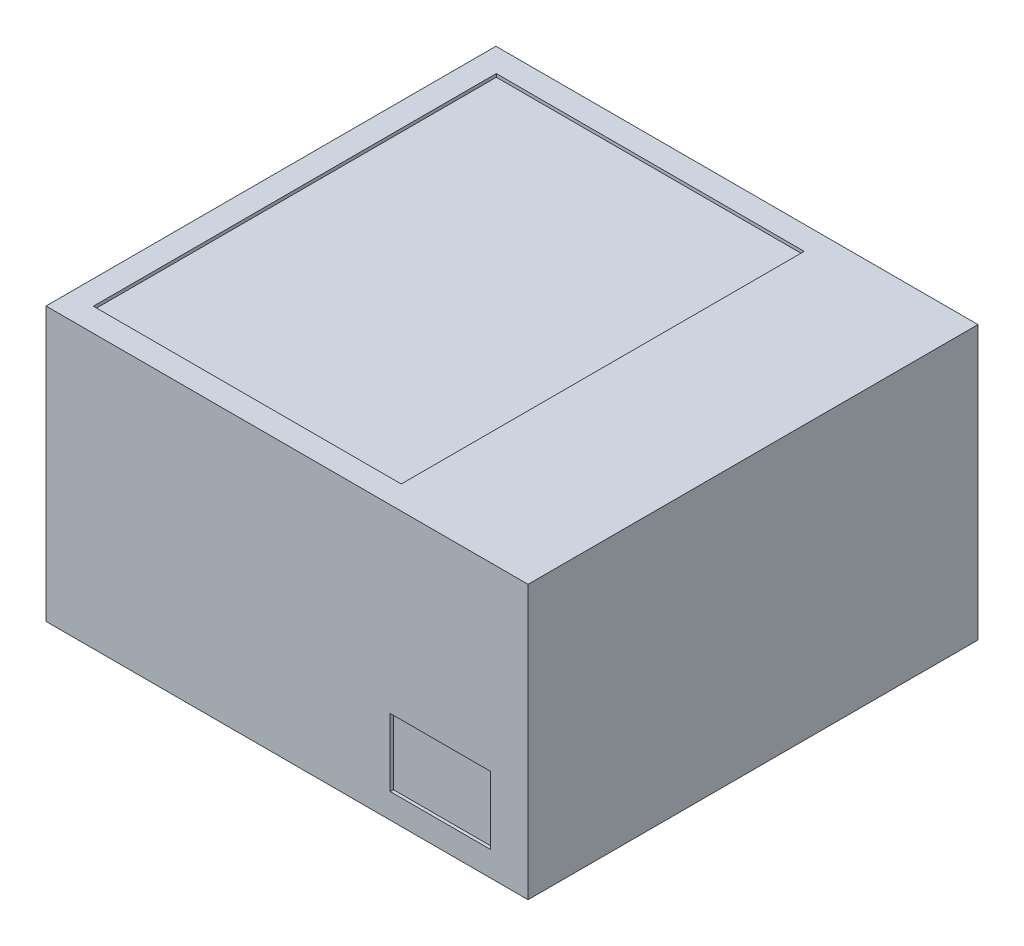
ISO-10303-21;
HEADER;
FILE_DESCRIPTION(('STEP AP214'),'2;1');
FILE_NAME('part.step','',(''),(''),'','','');
FILE_SCHEMA(('AUTOMOTIVE_DESIGN { 1 0 10303 214 1 1 1 1 }'));
ENDSEC;
DATA;
#1=APPLICATION_CONTEXT('core data for automotive mechanical design processes');
#2=APPLICATION_PROTOCOL_DEFINITION('international standard','automotive_design',2000,#1);
#3=PRODUCT_CONTEXT('',#1,'mechanical');
#4=PRODUCT('Part','Part','',(#3));
#5=PRODUCT_RELATED_PRODUCT_CATEGORY('part','',(#4));
#6=PRODUCT_DEFINITION_FORMATION('','',#4);
#7=PRODUCT_DEFINITION_CONTEXT('part definition',#1,'design');
#8=PRODUCT_DEFINITION('design','',#6,#7);
#9=PRODUCT_DEFINITION_SHAPE('','',#8);
#10=(LENGTH_UNIT() NAMED_UNIT(*) SI_UNIT(.MILLI.,.METRE.));
#11=(NAMED_UNIT(*) PLANE_ANGLE_UNIT() SI_UNIT($,.RADIAN.));
#12=(NAMED_UNIT(*) SI_UNIT($,.STERADIAN.) SOLID_ANGLE_UNIT());
#13=UNCERTAINTY_MEASURE_WITH_UNIT(LENGTH_MEASURE(1.E-05),#10,'distance_accuracy_value','');
#14=(GEOMETRIC_REPRESENTATION_CONTEXT(3) GLOBAL_UNCERTAINTY_ASSIGNED_CONTEXT((#13)) GLOBAL_UNIT_ASSIGNED_CONTEXT((#10,
#11,#12)) REPRESENTATION_CONTEXT('',''));
#15=CARTESIAN_POINT('',(0.,0.,0.));
#16=DIRECTION('',(0.,0.,1.));
#17=DIRECTION('',(1.,0.,0.));
#18=AXIS2_PLACEMENT_3D('',#15,#16,#17);
#19=CARTESIAN_POINT('',(75.,85.,-70.));
#20=DIRECTION('',(-1.,0.,0.));
#21=DIRECTION('',(0.,0.,1.));
#22=AXIS2_PLACEMENT_3D('',#19,#20,#21);
#23=PLANE('',#22);
#24=DIRECTION('',(0.,0.,-1.));
#25=VECTOR('',#24,1.);
#26=CARTESIAN_POINT('',(75.,0.,-70.));
#27=LINE('',#26,#25);
#28=CARTESIAN_POINT('',(75.,0.,70.));
#29=VERTEX_POINT('',#28);
#30=CARTESIAN_POINT('',(75.,0.,-70.));
#31=VERTEX_POINT('',#30);
#32=EDGE_CURVE('E184',#29,#31,#27,.T.);
#33=ORIENTED_EDGE('',*,*,#32,.T.);
#34=DIRECTION('',(0.,-1.,0.));
#35=VECTOR('',#34,1.);
#36=CARTESIAN_POINT('',(75.,85.,-70.));
#37=LINE('',#36,#35);
#38=CARTESIAN_POINT('',(75.,85.,-70.));
#39=VERTEX_POINT('',#38);
#40=EDGE_CURVE('E11',#39,#31,#37,.T.);
#41=ORIENTED_EDGE('',*,*,#40,.F.);
#42=DIRECTION('',(0.,0.,-1.));
#43=VECTOR('',#42,1.);
#44=CARTESIAN_POINT('',(75.,85.,-70.));
#45=LINE('',#44,#43);
#46=CARTESIAN_POINT('',(75.,85.,70.));
#47=VERTEX_POINT('',#46);
#48=EDGE_CURVE('E190',#47,#39,#45,.T.);
#49=ORIENTED_EDGE('',*,*,#48,.F.);
#50=DIRECTION('',(0.,-1.,0.));
#51=VECTOR('',#50,1.);
#52=CARTESIAN_POINT('',(75.,85.,70.));
#53=LINE('',#52,#51);
#54=EDGE_CURVE('E200',#47,#29,#53,.T.);
#55=ORIENTED_EDGE('',*,*,#54,.T.);
#56=EDGE_LOOP('',(#33,#41,#49,#55));
#57=FACE_BOUND('',#56,.T.);
#58=ADVANCED_FACE('F33',(#57),#23,.F.);
#59=CARTESIAN_POINT('',(-75.,85.,-70.));
#60=DIRECTION('',(0.,0.,1.));
#61=DIRECTION('',(1.,0.,0.));
#62=AXIS2_PLACEMENT_3D('',#59,#60,#61);
#63=PLANE('',#62);
#64=DIRECTION('',(-1.,0.,0.));
#65=VECTOR('',#64,1.);
#66=CARTESIAN_POINT('',(-75.,0.,-70.));
#67=LINE('',#66,#65);
#68=CARTESIAN_POINT('',(-75.,0.,-70.));
#69=VERTEX_POINT('',#68);
#70=EDGE_CURVE('E203',#31,#69,#67,.T.);
#71=ORIENTED_EDGE('',*,*,#70,.T.);
#72=DIRECTION('',(0.,-1.,0.));
#73=VECTOR('',#72,1.);
#74=CARTESIAN_POINT('',(-75.,85.,-70.));
#75=LINE('',#74,#73);
#76=CARTESIAN_POINT('',(-75.,85.,-70.));
#77=VERTEX_POINT('',#76);
#78=EDGE_CURVE('E40',#77,#69,#75,.T.);
#79=ORIENTED_EDGE('',*,*,#78,.F.);
#80=DIRECTION('',(-1.,0.,0.));
#81=VECTOR('',#80,1.);
#82=CARTESIAN_POINT('',(-75.,85.,-70.));
#83=LINE('',#82,#81);
#84=EDGE_CURVE('E193',#39,#77,#83,.T.);
#85=ORIENTED_EDGE('',*,*,#84,.F.);
#86=ORIENTED_EDGE('',*,*,#40,.T.);
#87=EDGE_LOOP('',(#71,#79,#85,#86));
#88=FACE_BOUND('',#87,.T.);
#89=ADVANCED_FACE('F233',(#88),#63,.F.);
#90=CARTESIAN_POINT('',(-75.,85.,-70.));
#91=DIRECTION('',(1.,0.,0.));
#92=DIRECTION('',(0.,0.,-1.));
#93=AXIS2_PLACEMENT_3D('',#90,#91,#92);
#94=PLANE('',#93);
#95=DIRECTION('',(0.,0.,1.));
#96=VECTOR('',#95,1.);
#97=CARTESIAN_POINT('',(-75.,0.,-70.));
#98=LINE('',#97,#96);
#99=CARTESIAN_POINT('',(-75.,0.,70.));
#100=VERTEX_POINT('',#99);
#101=EDGE_CURVE('E205',#69,#100,#98,.T.);
#102=ORIENTED_EDGE('',*,*,#101,.T.);
#103=DIRECTION('',(0.,-1.,0.));
#104=VECTOR('',#103,1.);
#105=CARTESIAN_POINT('',(-75.,85.,70.));
#106=LINE('',#105,#104);
#107=CARTESIAN_POINT('',(-75.,85.,70.));
#108=VERTEX_POINT('',#107);
#109=EDGE_CURVE('E210',#108,#100,#106,.T.);
#110=ORIENTED_EDGE('',*,*,#109,.F.);
#111=DIRECTION('',(0.,0.,1.));
#112=VECTOR('',#111,1.);
#113=CARTESIAN_POINT('',(-75.,85.,-70.));
#114=LINE('',#113,#112);
#115=EDGE_CURVE('E196',#77,#108,#114,.T.);
#116=ORIENTED_EDGE('',*,*,#115,.F.);
#117=ORIENTED_EDGE('',*,*,#78,.T.);
#118=EDGE_LOOP('',(#102,#110,#116,#117));
#119=FACE_BOUND('',#118,.T.);
#120=ADVANCED_FACE('F217',(#119),#94,.F.);
#121=CARTESIAN_POINT('',(-75.,85.,70.));
#122=DIRECTION('',(0.,0.,-1.));
#123=DIRECTION('',(-1.,0.,0.));
#124=AXIS2_PLACEMENT_3D('',#121,#122,#123);
#125=PLANE('',#124);
#126=DIRECTION('',(-1.,0.,0.));
#127=VECTOR('',#126,1.);
#128=CARTESIAN_POINT('',(32.1031916807303,28.7582284713324,70.));
#129=LINE('',#128,#127);
#130=CARTESIAN_POINT('',(63.3086157222107,28.7582284713324,70.));
#131=VERTEX_POINT('',#130);
#132=CARTESIAN_POINT('',(32.1031916807303,28.7582284713324,70.));
#133=VERTEX_POINT('',#132);
#134=EDGE_CURVE('E174',#131,#133,#129,.T.);
#135=ORIENTED_EDGE('',*,*,#134,.F.);
#136=DIRECTION('',(0.,1.,0.));
#137=VECTOR('',#136,1.);
#138=CARTESIAN_POINT('',(63.3086157222107,28.7582284713324,70.));
#139=LINE('',#138,#137);
#140=CARTESIAN_POINT('',(63.3086157222107,7.71254953386347,70.));
#141=VERTEX_POINT('',#140);
#142=EDGE_CURVE('E55',#141,#131,#139,.T.);
#143=ORIENTED_EDGE('',*,*,#142,.F.);
#144=DIRECTION('',(1.,0.,0.));
#145=VECTOR('',#144,1.);
#146=CARTESIAN_POINT('',(32.1031916807303,7.71254953386347,70.));
#147=LINE('',#146,#145);
#148=CARTESIAN_POINT('',(32.1031916807303,7.71254953386347,70.));
#149=VERTEX_POINT('',#148);
#150=EDGE_CURVE('E163',#149,#141,#147,.T.);
#151=ORIENTED_EDGE('',*,*,#150,.F.);
#152=DIRECTION('',(0.,-1.,0.));
#153=VECTOR('',#152,1.);
#154=CARTESIAN_POINT('',(32.1031916807303,28.7582284713324,70.));
#155=LINE('',#154,#153);
#156=EDGE_CURVE('E177',#133,#149,#155,.T.);
#157=ORIENTED_EDGE('',*,*,#156,.F.);
#158=EDGE_LOOP('',(#135,#143,#151,#157));
#159=FACE_BOUND('',#158,.T.);
#160=DIRECTION('',(1.,0.,0.));
#161=VECTOR('',#160,1.);
#162=CARTESIAN_POINT('',(-75.,0.,70.));
#163=LINE('',#162,#161);
#164=EDGE_CURVE('E194',#100,#29,#163,.T.);
#165=ORIENTED_EDGE('',*,*,#164,.T.);
#166=ORIENTED_EDGE('',*,*,#54,.F.);
#167=DIRECTION('',(1.,0.,0.));
#168=VECTOR('',#167,1.);
#169=CARTESIAN_POINT('',(-75.,85.,70.));
#170=LINE('',#169,#168);
#171=EDGE_CURVE('E198',#108,#47,#170,.T.);
#172=ORIENTED_EDGE('',*,*,#171,.F.);
#173=ORIENTED_EDGE('',*,*,#109,.T.);
#174=EDGE_LOOP('',(#165,#166,#172,#173));
#175=FACE_BOUND('',#174,.T.);
#176=ADVANCED_FACE('F226',(#159,#175),#125,.F.);
#177=CARTESIAN_POINT('',(0.,85.,0.));
#178=DIRECTION('',(0.,1.,0.));
#179=DIRECTION('',(0.,0.,1.));
#180=AXIS2_PLACEMENT_3D('',#177,#178,#179);
#181=PLANE('',#180);
#182=DIRECTION('',(0.,0.,-1.));
#183=VECTOR('',#182,1.);
#184=CARTESIAN_POINT('',(28.2332079092171,85.,-62.6933496527897));
#185=LINE('',#184,#183);
#186=CARTESIAN_POINT('',(28.2332079092171,85.,62.6933496527897));
#187=VERTEX_POINT('',#186);
#188=CARTESIAN_POINT('',(28.2332079092171,85.,-62.6933496527897));
#189=VERTEX_POINT('',#188);
#190=EDGE_CURVE('E47',#187,#189,#185,.T.);
#191=ORIENTED_EDGE('',*,*,#190,.F.);
#192=DIRECTION('',(1.,0.,0.));
#193=VECTOR('',#192,1.);
#194=CARTESIAN_POINT('',(-67.5798940687358,85.,62.6933496527897));
#195=LINE('',#194,#193);
#196=CARTESIAN_POINT('',(-67.5798940687358,85.,62.6933496527897));
#197=VERTEX_POINT('',#196);
#198=EDGE_CURVE('E141',#197,#187,#195,.T.);
#199=ORIENTED_EDGE('',*,*,#198,.F.);
#200=DIRECTION('',(0.,0.,1.));
#201=VECTOR('',#200,1.);
#202=CARTESIAN_POINT('',(-67.5798940687358,85.,-62.6933496527897));
#203=LINE('',#202,#201);
#204=CARTESIAN_POINT('',(-67.5798940687358,85.,-62.6933496527897));
#205=VERTEX_POINT('',#204);
#206=EDGE_CURVE('E144',#205,#197,#203,.T.);
#207=ORIENTED_EDGE('',*,*,#206,.F.);
#208=DIRECTION('',(-1.,0.,0.));
#209=VECTOR('',#208,1.);
#210=CARTESIAN_POINT('',(-67.5798940687358,85.,-62.6933496527897));
#211=LINE('',#210,#209);
#212=EDGE_CURVE('E150',#189,#205,#211,.T.);
#213=ORIENTED_EDGE('',*,*,#212,.F.);
#214=EDGE_LOOP('',(#191,#199,#207,#213));
#215=FACE_BOUND('',#214,.T.);
#216=ORIENTED_EDGE('',*,*,#48,.T.);
#217=ORIENTED_EDGE('',*,*,#84,.T.);
#218=ORIENTED_EDGE('',*,*,#115,.T.);
#219=ORIENTED_EDGE('',*,*,#171,.T.);
#220=EDGE_LOOP('',(#216,#217,#218,#219));
#221=FACE_BOUND('',#220,.T.);
#222=ADVANCED_FACE('F232',(#215,#221),#181,.T.);
#223=CARTESIAN_POINT('',(0.,0.,0.));
#224=DIRECTION('',(0.,1.,0.));
#225=DIRECTION('',(0.,0.,1.));
#226=AXIS2_PLACEMENT_3D('',#223,#224,#225);
#227=PLANE('',#226);
#228=ORIENTED_EDGE('',*,*,#32,.F.);
#229=ORIENTED_EDGE('',*,*,#164,.F.);
#230=ORIENTED_EDGE('',*,*,#101,.F.);
#231=ORIENTED_EDGE('',*,*,#70,.F.);
#232=EDGE_LOOP('',(#228,#229,#230,#231));
#233=FACE_BOUND('',#232,.T.);
#234=ADVANCED_FACE('F223',(#233),#227,.F.);
#235=CARTESIAN_POINT('',(63.3086157222107,28.7582284713324,69.));
#236=DIRECTION('',(1.,0.,0.));
#237=DIRECTION('',(0.,0.,-1.));
#238=AXIS2_PLACEMENT_3D('',#235,#236,#237);
#239=PLANE('',#238);
#240=ORIENTED_EDGE('',*,*,#142,.T.);
#241=DIRECTION('',(0.,0.,1.));
#242=VECTOR('',#241,1.);
#243=CARTESIAN_POINT('',(63.3086157222107,28.7582284713324,69.));
#244=LINE('',#243,#242);
#245=CARTESIAN_POINT('',(63.3086157222107,28.7582284713324,69.));
#246=VERTEX_POINT('',#245);
#247=EDGE_CURVE('E172',#246,#131,#244,.T.);
#248=ORIENTED_EDGE('',*,*,#247,.F.);
#249=DIRECTION('',(0.,1.,0.));
#250=VECTOR('',#249,1.);
#251=CARTESIAN_POINT('',(63.3086157222107,28.7582284713324,69.));
#252=LINE('',#251,#250);
#253=CARTESIAN_POINT('',(63.3086157222107,7.71254953386347,69.));
#254=VERTEX_POINT('',#253);
#255=EDGE_CURVE('E159',#254,#246,#252,.T.);
#256=ORIENTED_EDGE('',*,*,#255,.F.);
#257=DIRECTION('',(0.,0.,1.));
#258=VECTOR('',#257,1.);
#259=CARTESIAN_POINT('',(63.3086157222107,7.71254953386347,69.));
#260=LINE('',#259,#258);
#261=EDGE_CURVE('E182',#254,#141,#260,.T.);
#262=ORIENTED_EDGE('',*,*,#261,.T.);
#263=EDGE_LOOP('',(#240,#248,#256,#262));
#264=FACE_BOUND('',#263,.T.);
#265=ADVANCED_FACE('F246',(#264),#239,.F.);
#266=CARTESIAN_POINT('',(32.1031916807303,7.71254953386347,69.));
#267=DIRECTION('',(0.,-1.,0.));
#268=DIRECTION('',(0.,0.,-1.));
#269=AXIS2_PLACEMENT_3D('',#266,#267,#268);
#270=PLANE('',#269);
#271=ORIENTED_EDGE('',*,*,#150,.T.);
#272=ORIENTED_EDGE('',*,*,#261,.F.);
#273=DIRECTION('',(1.,0.,0.));
#274=VECTOR('',#273,1.);
#275=CARTESIAN_POINT('',(32.1031916807303,7.71254953386347,69.));
#276=LINE('',#275,#274);
#277=CARTESIAN_POINT('',(32.1031916807303,7.71254953386347,69.));
#278=VERTEX_POINT('',#277);
#279=EDGE_CURVE('E169',#278,#254,#276,.T.);
#280=ORIENTED_EDGE('',*,*,#279,.F.);
#281=DIRECTION('',(0.,0.,1.));
#282=VECTOR('',#281,1.);
#283=CARTESIAN_POINT('',(32.1031916807303,7.71254953386347,69.));
#284=LINE('',#283,#282);
#285=EDGE_CURVE('E185',#278,#149,#284,.T.);
#286=ORIENTED_EDGE('',*,*,#285,.T.);
#287=EDGE_LOOP('',(#271,#272,#280,#286));
#288=FACE_BOUND('',#287,.T.);
#289=ADVANCED_FACE('F252',(#288),#270,.F.);
#290=CARTESIAN_POINT('',(32.1031916807303,28.7582284713324,69.));
#291=DIRECTION('',(-1.,0.,0.));
#292=DIRECTION('',(0.,0.,1.));
#293=AXIS2_PLACEMENT_3D('',#290,#291,#292);
#294=PLANE('',#293);
#295=ORIENTED_EDGE('',*,*,#156,.T.);
#296=ORIENTED_EDGE('',*,*,#285,.F.);
#297=DIRECTION('',(0.,-1.,0.));
#298=VECTOR('',#297,1.);
#299=CARTESIAN_POINT('',(32.1031916807303,28.7582284713324,69.));
#300=LINE('',#299,#298);
#301=CARTESIAN_POINT('',(32.1031916807303,28.7582284713324,69.));
#302=VERTEX_POINT('',#301);
#303=EDGE_CURVE('E166',#302,#278,#300,.T.);
#304=ORIENTED_EDGE('',*,*,#303,.F.);
#305=DIRECTION('',(0.,0.,1.));
#306=VECTOR('',#305,1.);
#307=CARTESIAN_POINT('',(32.1031916807303,28.7582284713324,69.));
#308=LINE('',#307,#306);
#309=EDGE_CURVE('E187',#302,#133,#308,.T.);
#310=ORIENTED_EDGE('',*,*,#309,.T.);
#311=EDGE_LOOP('',(#295,#296,#304,#310));
#312=FACE_BOUND('',#311,.T.);
#313=ADVANCED_FACE('F257',(#312),#294,.F.);
#314=CARTESIAN_POINT('',(32.1031916807303,28.7582284713324,69.));
#315=DIRECTION('',(0.,1.,0.));
#316=DIRECTION('',(0.,0.,1.));
#317=AXIS2_PLACEMENT_3D('',#314,#315,#316);
#318=PLANE('',#317);
#319=ORIENTED_EDGE('',*,*,#134,.T.);
#320=ORIENTED_EDGE('',*,*,#309,.F.);
#321=DIRECTION('',(-1.,0.,0.));
#322=VECTOR('',#321,1.);
#323=CARTESIAN_POINT('',(32.1031916807303,28.7582284713324,69.));
#324=LINE('',#323,#322);
#325=EDGE_CURVE('E162',#246,#302,#324,.T.);
#326=ORIENTED_EDGE('',*,*,#325,.F.);
#327=ORIENTED_EDGE('',*,*,#247,.T.);
#328=EDGE_LOOP('',(#319,#320,#326,#327));
#329=FACE_BOUND('',#328,.T.);
#330=ADVANCED_FACE('F253',(#329),#318,.F.);
#331=CARTESIAN_POINT('',(0.,0.,69.));
#332=DIRECTION('',(0.,0.,1.));
#333=DIRECTION('',(1.,0.,0.));
#334=AXIS2_PLACEMENT_3D('',#331,#332,#333);
#335=PLANE('',#334);
#336=ORIENTED_EDGE('',*,*,#255,.T.);
#337=ORIENTED_EDGE('',*,*,#325,.T.);
#338=ORIENTED_EDGE('',*,*,#303,.T.);
#339=ORIENTED_EDGE('',*,*,#279,.T.);
#340=EDGE_LOOP('',(#336,#337,#338,#339));
#341=FACE_BOUND('',#340,.T.);
#342=ADVANCED_FACE('F256',(#341),#335,.T.);
#343=CARTESIAN_POINT('',(28.2332079092171,84.,-62.6933496527897));
#344=DIRECTION('',(1.,0.,0.));
#345=DIRECTION('',(0.,0.,-1.));
#346=AXIS2_PLACEMENT_3D('',#343,#344,#345);
#347=PLANE('',#346);
#348=ORIENTED_EDGE('',*,*,#190,.T.);
#349=DIRECTION('',(0.,1.,0.));
#350=VECTOR('',#349,1.);
#351=CARTESIAN_POINT('',(28.2332079092171,84.,-62.6933496527897));
#352=LINE('',#351,#350);
#353=CARTESIAN_POINT('',(28.2332079092171,84.,-62.6933496527897));
#354=VERTEX_POINT('',#353);
#355=EDGE_CURVE('E119',#354,#189,#352,.T.);
#356=ORIENTED_EDGE('',*,*,#355,.F.);
#357=DIRECTION('',(0.,0.,-1.));
#358=VECTOR('',#357,1.);
#359=CARTESIAN_POINT('',(28.2332079092171,84.,-62.6933496527897));
#360=LINE('',#359,#358);
#361=CARTESIAN_POINT('',(28.2332079092171,84.,62.6933496527897));
#362=VERTEX_POINT('',#361);
#363=EDGE_CURVE('E123',#362,#354,#360,.T.);
#364=ORIENTED_EDGE('',*,*,#363,.F.);
#365=DIRECTION('',(0.,1.,0.));
#366=VECTOR('',#365,1.);
#367=CARTESIAN_POINT('',(28.2332079092171,84.,62.6933496527897));
#368=LINE('',#367,#366);
#369=EDGE_CURVE('E154',#362,#187,#368,.T.);
#370=ORIENTED_EDGE('',*,*,#369,.T.);
#371=EDGE_LOOP('',(#348,#356,#364,#370));
#372=FACE_BOUND('',#371,.T.);
#373=ADVANCED_FACE('F121',(#372),#347,.F.);
#374=CARTESIAN_POINT('',(-67.5798940687358,84.,62.6933496527897));
#375=DIRECTION('',(0.,0.,1.));
#376=DIRECTION('',(1.,0.,0.));
#377=AXIS2_PLACEMENT_3D('',#374,#375,#376);
#378=PLANE('',#377);
#379=ORIENTED_EDGE('',*,*,#198,.T.);
#380=ORIENTED_EDGE('',*,*,#369,.F.);
#381=DIRECTION('',(1.,0.,0.));
#382=VECTOR('',#381,1.);
#383=CARTESIAN_POINT('',(-67.5798940687358,84.,62.6933496527897));
#384=LINE('',#383,#382);
#385=CARTESIAN_POINT('',(-67.5798940687358,84.,62.6933496527897));
#386=VERTEX_POINT('',#385);
#387=EDGE_CURVE('E129',#386,#362,#384,.T.);
#388=ORIENTED_EDGE('',*,*,#387,.F.);
#389=DIRECTION('',(0.,1.,0.));
#390=VECTOR('',#389,1.);
#391=CARTESIAN_POINT('',(-67.5798940687358,84.,62.6933496527897));
#392=LINE('',#391,#390);
#393=EDGE_CURVE('E156',#386,#197,#392,.T.);
#394=ORIENTED_EDGE('',*,*,#393,.T.);
#395=EDGE_LOOP('',(#379,#380,#388,#394));
#396=FACE_BOUND('',#395,.T.);
#397=ADVANCED_FACE('F270',(#396),#378,.F.);
#398=CARTESIAN_POINT('',(-67.5798940687358,84.,-62.6933496527897));
#399=DIRECTION('',(-1.,0.,0.));
#400=DIRECTION('',(0.,0.,1.));
#401=AXIS2_PLACEMENT_3D('',#398,#399,#400);
#402=PLANE('',#401);
#403=ORIENTED_EDGE('',*,*,#206,.T.);
#404=ORIENTED_EDGE('',*,*,#393,.F.);
#405=DIRECTION('',(0.,0.,1.));
#406=VECTOR('',#405,1.);
#407=CARTESIAN_POINT('',(-67.5798940687358,84.,-62.6933496527897));
#408=LINE('',#407,#406);
#409=CARTESIAN_POINT('',(-67.5798940687358,84.,-62.6933496527897));
#410=VERTEX_POINT('',#409);
#411=EDGE_CURVE('E137',#410,#386,#408,.T.);
#412=ORIENTED_EDGE('',*,*,#411,.F.);
#413=DIRECTION('',(0.,1.,0.));
#414=VECTOR('',#413,1.);
#415=CARTESIAN_POINT('',(-67.5798940687358,84.,-62.6933496527897));
#416=LINE('',#415,#414);
#417=EDGE_CURVE('E128',#410,#205,#416,.T.);
#418=ORIENTED_EDGE('',*,*,#417,.T.);
#419=EDGE_LOOP('',(#403,#404,#412,#418));
#420=FACE_BOUND('',#419,.T.);
#421=ADVANCED_FACE('F273',(#420),#402,.F.);
#422=CARTESIAN_POINT('',(-67.5798940687358,84.,-62.6933496527897));
#423=DIRECTION('',(0.,0.,-1.));
#424=DIRECTION('',(-1.,0.,0.));
#425=AXIS2_PLACEMENT_3D('',#422,#423,#424);
#426=PLANE('',#425);
#427=ORIENTED_EDGE('',*,*,#212,.T.);
#428=ORIENTED_EDGE('',*,*,#417,.F.);
#429=DIRECTION('',(-1.,0.,0.));
#430=VECTOR('',#429,1.);
#431=CARTESIAN_POINT('',(-67.5798940687358,84.,-62.6933496527897));
#432=LINE('',#431,#430);
#433=EDGE_CURVE('E132',#354,#410,#432,.T.);
#434=ORIENTED_EDGE('',*,*,#433,.F.);
#435=ORIENTED_EDGE('',*,*,#355,.T.);
#436=EDGE_LOOP('',(#427,#428,#434,#435));
#437=FACE_BOUND('',#436,.T.);
#438=ADVANCED_FACE('F133',(#437),#426,.F.);
#439=CARTESIAN_POINT('',(0.,84.,0.));
#440=DIRECTION('',(0.,1.,0.));
#441=DIRECTION('',(0.,0.,1.));
#442=AXIS2_PLACEMENT_3D('',#439,#440,#441);
#443=PLANE('',#442);
#444=ORIENTED_EDGE('',*,*,#363,.T.);
#445=ORIENTED_EDGE('',*,*,#433,.T.);
#446=ORIENTED_EDGE('',*,*,#411,.T.);
#447=ORIENTED_EDGE('',*,*,#387,.T.);
#448=EDGE_LOOP('',(#444,#445,#446,#447));
#449=FACE_BOUND('',#448,.T.);
#450=ADVANCED_FACE('F139',(#449),#443,.T.);
#451=CLOSED_SHELL('',(#58,#89,#120,#176,#222,#234,#265,#289,#313,#330,#342,#373,#397,#421,#438,#450));
#452=MANIFOLD_SOLID_BREP('B2',#451);
#453=ADVANCED_BREP_SHAPE_REPRESENTATION('',(#18,#452),#14);
#454=SHAPE_DEFINITION_REPRESENTATION(#9,#453);
ENDSEC;
END-ISO-10303-21;
